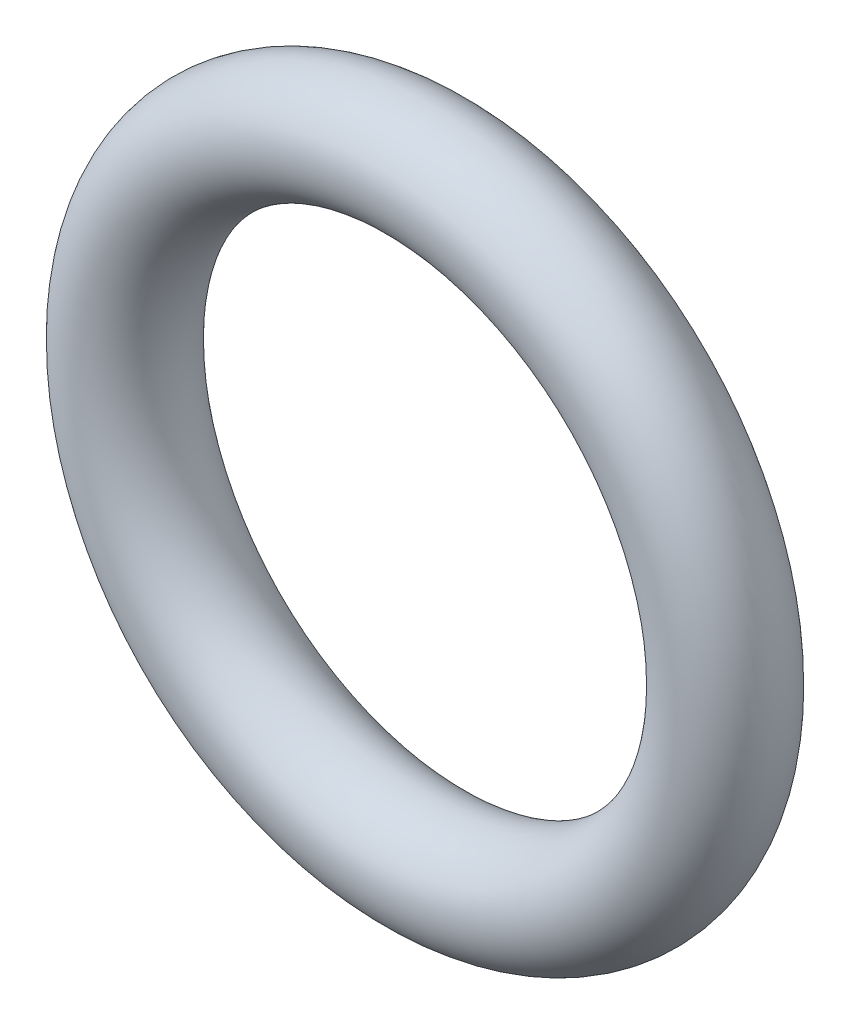
ISO-10303-21;
HEADER;
FILE_DESCRIPTION(('STEP AP214'),'2;1');
FILE_NAME('part.step','',(''),(''),'','','');
FILE_SCHEMA(('AUTOMOTIVE_DESIGN { 1 0 10303 214 1 1 1 1 }'));
ENDSEC;
DATA;
#1=APPLICATION_CONTEXT('core data for automotive mechanical design processes');
#2=APPLICATION_PROTOCOL_DEFINITION('international standard','automotive_design',2000,#1);
#3=PRODUCT_CONTEXT('',#1,'mechanical');
#4=PRODUCT('Part','Part','',(#3));
#5=PRODUCT_RELATED_PRODUCT_CATEGORY('part','',(#4));
#6=PRODUCT_DEFINITION_FORMATION('','',#4);
#7=PRODUCT_DEFINITION_CONTEXT('part definition',#1,'design');
#8=PRODUCT_DEFINITION('design','',#6,#7);
#9=PRODUCT_DEFINITION_SHAPE('','',#8);
#10=(LENGTH_UNIT() NAMED_UNIT(*) SI_UNIT(.MILLI.,.METRE.));
#11=(NAMED_UNIT(*) PLANE_ANGLE_UNIT() SI_UNIT($,.RADIAN.));
#12=(NAMED_UNIT(*) SI_UNIT($,.STERADIAN.) SOLID_ANGLE_UNIT());
#13=UNCERTAINTY_MEASURE_WITH_UNIT(LENGTH_MEASURE(1.E-05),#10,'distance_accuracy_value','');
#14=(GEOMETRIC_REPRESENTATION_CONTEXT(3) GLOBAL_UNCERTAINTY_ASSIGNED_CONTEXT((#13)) GLOBAL_UNIT_ASSIGNED_CONTEXT((#10,
#11,#12)) REPRESENTATION_CONTEXT('',''));
#15=CARTESIAN_POINT('',(0.,0.,0.));
#16=DIRECTION('',(0.,0.,1.));
#17=DIRECTION('',(1.,0.,0.));
#18=AXIS2_PLACEMENT_3D('',#15,#16,#17);
#19=CARTESIAN_POINT('',(0.,0.,0.));
#20=DIRECTION('',(0.,0.,1.));
#21=DIRECTION('',(1.,0.,0.));
#22=AXIS2_PLACEMENT_3D('',#19,#20,#21);
#23=TOROIDAL_SURFACE('',#22,6.75,1.25);
#24=CARTESIAN_POINT('',(8.,0.,0.));
#25=VERTEX_POINT('',#24);
#26=VERTEX_LOOP('',#25);
#27=FACE_BOUND('',#26,.T.);
#28=ADVANCED_FACE('F31',(#27),#23,.T.);
#29=CLOSED_SHELL('',(#28));
#30=MANIFOLD_SOLID_BREP('B2',#29);
#31=ADVANCED_BREP_SHAPE_REPRESENTATION('',(#18,#30),#14);
#32=SHAPE_DEFINITION_REPRESENTATION(#9,#31);
ENDSEC;
END-ISO-10303-21;
